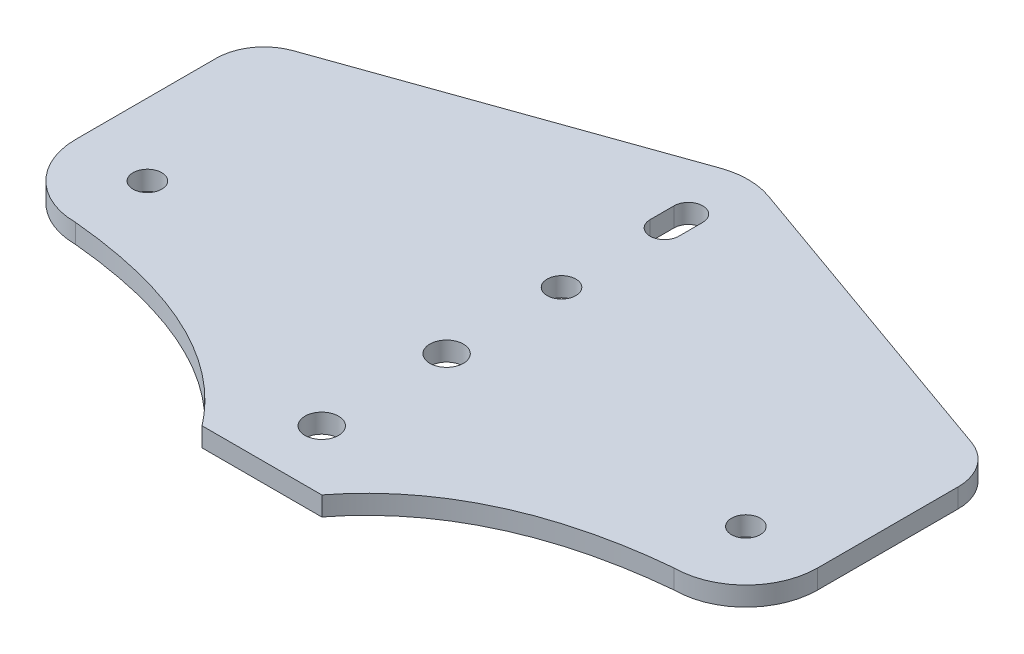
ISO-10303-21;
HEADER;
FILE_DESCRIPTION(('STEP AP214'),'2;1');
FILE_NAME('part.step','',(''),(''),'','','');
FILE_SCHEMA(('AUTOMOTIVE_DESIGN { 1 0 10303 214 1 1 1 1 }'));
ENDSEC;
DATA;
#1=APPLICATION_CONTEXT('core data for automotive mechanical design processes');
#2=APPLICATION_PROTOCOL_DEFINITION('international standard','automotive_design',2000,#1);
#3=PRODUCT_CONTEXT('',#1,'mechanical');
#4=PRODUCT('Part','Part','',(#3));
#5=PRODUCT_RELATED_PRODUCT_CATEGORY('part','',(#4));
#6=PRODUCT_DEFINITION_FORMATION('','',#4);
#7=PRODUCT_DEFINITION_CONTEXT('part definition',#1,'design');
#8=PRODUCT_DEFINITION('design','',#6,#7);
#9=PRODUCT_DEFINITION_SHAPE('','',#8);
#10=(LENGTH_UNIT() NAMED_UNIT(*) SI_UNIT(.MILLI.,.METRE.));
#11=(NAMED_UNIT(*) PLANE_ANGLE_UNIT() SI_UNIT($,.RADIAN.));
#12=(NAMED_UNIT(*) SI_UNIT($,.STERADIAN.) SOLID_ANGLE_UNIT());
#13=UNCERTAINTY_MEASURE_WITH_UNIT(LENGTH_MEASURE(1.E-05),#10,'distance_accuracy_value','');
#14=(GEOMETRIC_REPRESENTATION_CONTEXT(3) GLOBAL_UNCERTAINTY_ASSIGNED_CONTEXT((#13)) GLOBAL_UNIT_ASSIGNED_CONTEXT((#10,
#11,#12)) REPRESENTATION_CONTEXT('',''));
#15=CARTESIAN_POINT('',(0.,0.,0.));
#16=DIRECTION('',(0.,0.,1.));
#17=DIRECTION('',(1.,0.,0.));
#18=AXIS2_PLACEMENT_3D('',#15,#16,#17);
#19=CARTESIAN_POINT('',(-66.2159705452722,4.,46.2836736201994));
#20=DIRECTION('',(0.,1.,0.));
#21=DIRECTION('',(0.,0.,1.));
#22=AXIS2_PLACEMENT_3D('',#19,#20,#21);
#23=PLANE('',#22);
#24=CARTESIAN_POINT('',(-3.71597054527223,4.,46.2836736201994));
#25=DIRECTION('',(0.,1.,0.));
#26=DIRECTION('',(0.,0.,1.));
#27=AXIS2_PLACEMENT_3D('',#24,#25,#26);
#28=CIRCLE('',#27,3.5);
#29=CARTESIAN_POINT('',(-3.71597054527223,4.,49.7836736201994));
#30=VERTEX_POINT('',#29);
#31=EDGE_CURVE('E188',#30,#30,#28,.T.);
#32=ORIENTED_EDGE('',*,*,#31,.F.);
#33=EDGE_LOOP('',(#32));
#34=FACE_BOUND('',#33,.T.);
#35=CARTESIAN_POINT('',(-66.2159705452722,4.,46.2836736201994));
#36=DIRECTION('',(0.,1.,0.));
#37=DIRECTION('',(0.,0.,1.));
#38=AXIS2_PLACEMENT_3D('',#35,#36,#37);
#39=CIRCLE('',#38,3.00000000000001);
#40=CARTESIAN_POINT('',(-66.2159705452722,4.,49.2836736201994));
#41=VERTEX_POINT('',#40);
#42=EDGE_CURVE('E212',#41,#41,#39,.T.);
#43=ORIENTED_EDGE('',*,*,#42,.F.);
#44=EDGE_LOOP('',(#43));
#45=FACE_BOUND('',#44,.T.);
#46=CARTESIAN_POINT('',(-66.2159705452722,4.,46.2836736201994));
#47=DIRECTION('',(0.,1.,0.));
#48=DIRECTION('',(0.,0.,1.));
#49=AXIS2_PLACEMENT_3D('',#46,#47,#48);
#50=CIRCLE('',#49,15.);
#51=CARTESIAN_POINT('',(-81.2159705452722,4.,46.2836736201994));
#52=VERTEX_POINT('',#51);
#53=CARTESIAN_POINT('',(-66.2159705452722,4.,61.2836736201994));
#54=VERTEX_POINT('',#53);
#55=EDGE_CURVE('E228',#52,#54,#50,.T.);
#56=ORIENTED_EDGE('',*,*,#55,.T.);
#57=CARTESIAN_POINT('',(-66.2159705452722,4.,61.2836736201994));
#58=CARTESIAN_POINT('',(-31.9884086190138,4.,64.4698398960954));
#59=CARTESIAN_POINT('',(-16.2159705452722,4.,84.8626355878748));
#60=B_SPLINE_CURVE_WITH_KNOTS('',2,(#57,#58,#59),.UNSPECIFIED.,.F.,.F.,(3,3),(0.,
0.615675343805839),.UNSPECIFIED.);
#61=CARTESIAN_POINT('',(-16.2159705452722,4.,84.8626355878748));
#62=VERTEX_POINT('',#61);
#63=EDGE_CURVE('E232',#54,#62,#60,.T.);
#64=ORIENTED_EDGE('',*,*,#63,.T.);
#65=DIRECTION('',(1.,0.,0.));
#66=VECTOR('',#65,1.);
#67=CARTESIAN_POINT('',(-16.2159705452722,4.,84.8626355878748));
#68=LINE('',#67,#66);
#69=CARTESIAN_POINT('',(8.78402945472778,4.,84.8626355878748));
#70=VERTEX_POINT('',#69);
#71=EDGE_CURVE('E239',#62,#70,#68,.T.);
#72=ORIENTED_EDGE('',*,*,#71,.T.);
#73=CARTESIAN_POINT('',(8.78402945472778,4.,84.8626355878748));
#74=CARTESIAN_POINT('',(24.5564675284694,4.,64.4698398960954));
#75=CARTESIAN_POINT('',(58.7840294547278,4.,61.2836736201994));
#76=B_SPLINE_CURVE_WITH_KNOTS('',2,(#73,#74,#75),.UNSPECIFIED.,.F.,.F.,(3,3),(0.,
0.615675343805838),.UNSPECIFIED.);
#77=CARTESIAN_POINT('',(58.7840294547278,4.,61.2836736201994));
#78=VERTEX_POINT('',#77);
#79=EDGE_CURVE('E258',#70,#78,#76,.T.);
#80=ORIENTED_EDGE('',*,*,#79,.T.);
#81=CARTESIAN_POINT('',(58.7840294547278,4.,46.2836736201994));
#82=DIRECTION('',(0.,1.,0.));
#83=DIRECTION('',(0.,0.,1.));
#84=AXIS2_PLACEMENT_3D('',#81,#82,#83);
#85=CIRCLE('',#84,15.);
#86=CARTESIAN_POINT('',(73.7840294547278,4.,46.2836736201994));
#87=VERTEX_POINT('',#86);
#88=EDGE_CURVE('E264',#78,#87,#85,.T.);
#89=ORIENTED_EDGE('',*,*,#88,.T.);
#90=DIRECTION('',(0.,0.,-1.));
#91=VECTOR('',#90,1.);
#92=CARTESIAN_POINT('',(73.7840294547278,4.,46.2836736201994));
#93=LINE('',#92,#91);
#94=CARTESIAN_POINT('',(73.7840294547278,4.,16.9255729833547));
#95=VERTEX_POINT('',#94);
#96=EDGE_CURVE('E270',#87,#95,#93,.T.);
#97=ORIENTED_EDGE('',*,*,#96,.T.);
#98=CARTESIAN_POINT('',(63.7840294547278,4.,16.9255729833547));
#99=DIRECTION('',(0.,1.,0.));
#100=DIRECTION('',(0.,0.,1.));
#101=AXIS2_PLACEMENT_3D('',#98,#99,#100);
#102=CIRCLE('',#101,10.);
#103=CARTESIAN_POINT('',(67.1275853171226,4.,7.50110301443627));
#104=VERTEX_POINT('',#103);
#105=EDGE_CURVE('E273',#95,#104,#102,.T.);
#106=ORIENTED_EDGE('',*,*,#105,.T.);
#107=DIRECTION('',(-0.942446996891839,0.,-0.33435558623949));
#108=VECTOR('',#107,1.);
#109=CARTESIAN_POINT('',(67.1275853171226,4.,7.50110301443627));
#110=LINE('',#109,#108);
#111=CARTESIAN_POINT('',(1.29936324832012,4.,-15.8530313331782));
#112=VERTEX_POINT('',#111);
#113=EDGE_CURVE('E276',#104,#112,#110,.T.);
#114=ORIENTED_EDGE('',*,*,#113,.T.);
#115=CARTESIAN_POINT('',(-3.71597054527223,4.,-1.7163263798006));
#116=DIRECTION('',(0.,1.,0.));
#117=DIRECTION('',(0.,0.,1.));
#118=AXIS2_PLACEMENT_3D('',#115,#116,#117);
#119=CIRCLE('',#118,15.);
#120=CARTESIAN_POINT('',(-8.73130433886458,4.,-15.8530313331782));
#121=VERTEX_POINT('',#120);
#122=EDGE_CURVE('E279',#112,#121,#119,.T.);
#123=ORIENTED_EDGE('',*,*,#122,.T.);
#124=DIRECTION('',(-0.942446996891839,0.,0.33435558623949));
#125=VECTOR('',#124,1.);
#126=CARTESIAN_POINT('',(-74.5595264076671,4.,7.50110301443627));
#127=LINE('',#126,#125);
#128=CARTESIAN_POINT('',(-74.5595264076671,4.,7.50110301443627));
#129=VERTEX_POINT('',#128);
#130=EDGE_CURVE('E282',#121,#129,#127,.T.);
#131=ORIENTED_EDGE('',*,*,#130,.T.);
#132=CARTESIAN_POINT('',(-71.2159705452722,4.,16.9255729833547));
#133=DIRECTION('',(0.,1.,0.));
#134=DIRECTION('',(0.,0.,-1.));
#135=AXIS2_PLACEMENT_3D('',#132,#133,#134);
#136=CIRCLE('',#135,10.);
#137=CARTESIAN_POINT('',(-81.2159705452722,4.,16.9255729833547));
#138=VERTEX_POINT('',#137);
#139=EDGE_CURVE('E285',#129,#138,#136,.T.);
#140=ORIENTED_EDGE('',*,*,#139,.T.);
#141=DIRECTION('',(0.,0.,1.));
#142=VECTOR('',#141,1.);
#143=CARTESIAN_POINT('',(-81.2159705452722,4.,46.2836736201994));
#144=LINE('',#143,#142);
#145=EDGE_CURVE('E288',#138,#52,#144,.T.);
#146=ORIENTED_EDGE('',*,*,#145,.T.);
#147=EDGE_LOOP('',(#56,#64,#72,#80,#89,#97,#106,#114,#123,#131,#140,#146));
#148=FACE_BOUND('',#147,.T.);
#149=CARTESIAN_POINT('',(-3.71597054527223,4.,22.2836736201994));
#150=DIRECTION('',(0.,1.,0.));
#151=DIRECTION('',(0.,0.,1.));
#152=AXIS2_PLACEMENT_3D('',#149,#150,#151);
#153=CIRCLE('',#152,3.);
#154=CARTESIAN_POINT('',(-3.71597054527223,4.,25.2836736201994));
#155=VERTEX_POINT('',#154);
#156=EDGE_CURVE('E220',#155,#155,#153,.T.);
#157=ORIENTED_EDGE('',*,*,#156,.F.);
#158=EDGE_LOOP('',(#157));
#159=FACE_BOUND('',#158,.T.);
#160=CARTESIAN_POINT('',(58.7840294547278,4.,46.2836736201994));
#161=DIRECTION('',(0.,1.,0.));
#162=DIRECTION('',(0.,0.,1.));
#163=AXIS2_PLACEMENT_3D('',#160,#161,#162);
#164=CIRCLE('',#163,3.);
#165=CARTESIAN_POINT('',(58.7840294547278,4.,49.2836736201994));
#166=VERTEX_POINT('',#165);
#167=EDGE_CURVE('E204',#166,#166,#164,.T.);
#168=ORIENTED_EDGE('',*,*,#167,.F.);
#169=EDGE_LOOP('',(#168));
#170=FACE_BOUND('',#169,.T.);
#171=DIRECTION('',(0.,0.,1.));
#172=VECTOR('',#171,1.);
#173=CARTESIAN_POINT('',(-6.71597054527223,4.,-4.2163263798006));
#174=LINE('',#173,#172);
#175=CARTESIAN_POINT('',(-6.71597054527223,4.,-4.2163263798006));
#176=VERTEX_POINT('',#175);
#177=CARTESIAN_POINT('',(-6.71597054527223,4.,0.783673620199402));
#178=VERTEX_POINT('',#177);
#179=EDGE_CURVE('E162',#176,#178,#174,.T.);
#180=ORIENTED_EDGE('',*,*,#179,.F.);
#181=CARTESIAN_POINT('',(-3.71597054527223,4.,-4.2163263798006));
#182=DIRECTION('',(0.,1.,0.));
#183=DIRECTION('',(0.,0.,1.));
#184=AXIS2_PLACEMENT_3D('',#181,#182,#183);
#185=CIRCLE('',#184,3.);
#186=CARTESIAN_POINT('',(-0.715970545272232,4.,-4.2163263798006));
#187=VERTEX_POINT('',#186);
#188=EDGE_CURVE('E153',#187,#176,#185,.T.);
#189=ORIENTED_EDGE('',*,*,#188,.F.);
#190=DIRECTION('',(0.,0.,-1.));
#191=VECTOR('',#190,1.);
#192=CARTESIAN_POINT('',(-0.715970545272232,4.,-4.2163263798006));
#193=LINE('',#192,#191);
#194=CARTESIAN_POINT('',(-0.715970545272226,4.,0.783673620199404));
#195=VERTEX_POINT('',#194);
#196=EDGE_CURVE('E180',#195,#187,#193,.T.);
#197=ORIENTED_EDGE('',*,*,#196,.F.);
#198=CARTESIAN_POINT('',(-3.71597054527223,4.,0.783673620199403));
#199=DIRECTION('',(0.,1.,0.));
#200=DIRECTION('',(0.,0.,1.));
#201=AXIS2_PLACEMENT_3D('',#198,#199,#200);
#202=CIRCLE('',#201,3.);
#203=EDGE_CURVE('E176',#178,#195,#202,.T.);
#204=ORIENTED_EDGE('',*,*,#203,.F.);
#205=EDGE_LOOP('',(#180,#189,#197,#204));
#206=FACE_BOUND('',#205,.T.);
#207=CARTESIAN_POINT('',(-3.71597054527222,4.,72.3626355878748));
#208=DIRECTION('',(0.,1.,0.));
#209=DIRECTION('',(0.,0.,1.));
#210=AXIS2_PLACEMENT_3D('',#207,#208,#209);
#211=CIRCLE('',#210,3.5);
#212=CARTESIAN_POINT('',(-3.71597054527222,4.,75.8626355878748));
#213=VERTEX_POINT('',#212);
#214=EDGE_CURVE('E628',#213,#213,#211,.T.);
#215=ORIENTED_EDGE('',*,*,#214,.F.);
#216=EDGE_LOOP('',(#215));
#217=FACE_BOUND('',#216,.T.);
#218=ADVANCED_FACE('F39',(#34,#45,#148,#159,#170,#206,#217),#23,.T.);
#219=CARTESIAN_POINT('',(-66.2159705452722,0.,46.2836736201994));
#220=DIRECTION('',(0.,1.,0.));
#221=DIRECTION('',(0.,0.,1.));
#222=AXIS2_PLACEMENT_3D('',#219,#220,#221);
#223=PLANE('',#222);
#224=CARTESIAN_POINT('',(58.7840294547278,0.,46.2836736201994));
#225=DIRECTION('',(0.,1.,0.));
#226=DIRECTION('',(0.,0.,1.));
#227=AXIS2_PLACEMENT_3D('',#224,#225,#226);
#228=CIRCLE('',#227,3.);
#229=CARTESIAN_POINT('',(58.7840294547278,0.,49.2836736201994));
#230=VERTEX_POINT('',#229);
#231=EDGE_CURVE('E171',#230,#230,#228,.T.);
#232=ORIENTED_EDGE('',*,*,#231,.T.);
#233=EDGE_LOOP('',(#232));
#234=FACE_BOUND('',#233,.T.);
#235=CARTESIAN_POINT('',(-66.2159705452722,0.,46.2836736201994));
#236=DIRECTION('',(0.,1.,0.));
#237=DIRECTION('',(0.,0.,1.));
#238=AXIS2_PLACEMENT_3D('',#235,#236,#237);
#239=CIRCLE('',#238,3.00000000000001);
#240=CARTESIAN_POINT('',(-66.2159705452722,0.,49.2836736201994));
#241=VERTEX_POINT('',#240);
#242=EDGE_CURVE('E208',#241,#241,#239,.T.);
#243=ORIENTED_EDGE('',*,*,#242,.T.);
#244=EDGE_LOOP('',(#243));
#245=FACE_BOUND('',#244,.T.);
#246=CARTESIAN_POINT('',(-3.71597054527223,0.,22.2836736201994));
#247=DIRECTION('',(0.,1.,0.));
#248=DIRECTION('',(0.,0.,1.));
#249=AXIS2_PLACEMENT_3D('',#246,#247,#248);
#250=CIRCLE('',#249,3.);
#251=CARTESIAN_POINT('',(-3.71597054527223,0.,25.2836736201994));
#252=VERTEX_POINT('',#251);
#253=EDGE_CURVE('E216',#252,#252,#250,.T.);
#254=ORIENTED_EDGE('',*,*,#253,.T.);
#255=EDGE_LOOP('',(#254));
#256=FACE_BOUND('',#255,.T.);
#257=CARTESIAN_POINT('',(-66.2159705452722,0.,46.2836736201994));
#258=DIRECTION('',(0.,1.,0.));
#259=DIRECTION('',(0.,0.,1.));
#260=AXIS2_PLACEMENT_3D('',#257,#258,#259);
#261=CIRCLE('',#260,15.);
#262=CARTESIAN_POINT('',(-81.2159705452722,0.,46.2836736201994));
#263=VERTEX_POINT('',#262);
#264=CARTESIAN_POINT('',(-66.2159705452722,0.,61.2836736201994));
#265=VERTEX_POINT('',#264);
#266=EDGE_CURVE('E224',#263,#265,#261,.T.);
#267=ORIENTED_EDGE('',*,*,#266,.F.);
#268=DIRECTION('',(0.,0.,1.));
#269=VECTOR('',#268,1.);
#270=CARTESIAN_POINT('',(-81.2159705452722,0.,46.2836736201994));
#271=LINE('',#270,#269);
#272=CARTESIAN_POINT('',(-81.2159705452722,0.,16.9255729833547));
#273=VERTEX_POINT('',#272);
#274=EDGE_CURVE('E233',#273,#263,#271,.T.);
#275=ORIENTED_EDGE('',*,*,#274,.F.);
#276=CARTESIAN_POINT('',(-71.2159705452722,0.,16.9255729833547));
#277=DIRECTION('',(0.,1.,0.));
#278=DIRECTION('',(0.,0.,-1.));
#279=AXIS2_PLACEMENT_3D('',#276,#277,#278);
#280=CIRCLE('',#279,10.);
#281=CARTESIAN_POINT('',(-74.5595264076671,0.,7.50110301443627));
#282=VERTEX_POINT('',#281);
#283=EDGE_CURVE('E332',#282,#273,#280,.T.);
#284=ORIENTED_EDGE('',*,*,#283,.F.);
#285=DIRECTION('',(-0.942446996891839,0.,0.33435558623949));
#286=VECTOR('',#285,1.);
#287=CARTESIAN_POINT('',(-74.5595264076671,0.,7.50110301443627));
#288=LINE('',#287,#286);
#289=CARTESIAN_POINT('',(-8.73130433886458,0.,-15.8530313331782));
#290=VERTEX_POINT('',#289);
#291=EDGE_CURVE('E329',#290,#282,#288,.T.);
#292=ORIENTED_EDGE('',*,*,#291,.F.);
#293=CARTESIAN_POINT('',(-3.71597054527223,0.,-1.7163263798006));
#294=DIRECTION('',(0.,1.,0.));
#295=DIRECTION('',(0.,0.,1.));
#296=AXIS2_PLACEMENT_3D('',#293,#294,#295);
#297=CIRCLE('',#296,15.);
#298=CARTESIAN_POINT('',(1.29936324832012,0.,-15.8530313331782));
#299=VERTEX_POINT('',#298);
#300=EDGE_CURVE('E326',#299,#290,#297,.T.);
#301=ORIENTED_EDGE('',*,*,#300,.F.);
#302=DIRECTION('',(-0.942446996891839,0.,-0.33435558623949));
#303=VECTOR('',#302,1.);
#304=CARTESIAN_POINT('',(67.1275853171226,0.,7.50110301443627));
#305=LINE('',#304,#303);
#306=CARTESIAN_POINT('',(67.1275853171226,0.,7.50110301443627));
#307=VERTEX_POINT('',#306);
#308=EDGE_CURVE('E323',#307,#299,#305,.T.);
#309=ORIENTED_EDGE('',*,*,#308,.F.);
#310=CARTESIAN_POINT('',(63.7840294547278,0.,16.9255729833547));
#311=DIRECTION('',(0.,1.,0.));
#312=DIRECTION('',(0.,0.,1.));
#313=AXIS2_PLACEMENT_3D('',#310,#311,#312);
#314=CIRCLE('',#313,10.);
#315=CARTESIAN_POINT('',(73.7840294547278,0.,16.9255729833547));
#316=VERTEX_POINT('',#315);
#317=EDGE_CURVE('E320',#316,#307,#314,.T.);
#318=ORIENTED_EDGE('',*,*,#317,.F.);
#319=DIRECTION('',(0.,0.,-1.));
#320=VECTOR('',#319,1.);
#321=CARTESIAN_POINT('',(73.7840294547278,0.,46.2836736201994));
#322=LINE('',#321,#320);
#323=CARTESIAN_POINT('',(73.7840294547278,0.,46.2836736201994));
#324=VERTEX_POINT('',#323);
#325=EDGE_CURVE('E317',#324,#316,#322,.T.);
#326=ORIENTED_EDGE('',*,*,#325,.F.);
#327=CARTESIAN_POINT('',(58.7840294547278,0.,46.2836736201994));
#328=DIRECTION('',(0.,1.,0.));
#329=DIRECTION('',(0.,0.,1.));
#330=AXIS2_PLACEMENT_3D('',#327,#328,#329);
#331=CIRCLE('',#330,15.);
#332=CARTESIAN_POINT('',(58.7840294547278,0.,61.2836736201994));
#333=VERTEX_POINT('',#332);
#334=EDGE_CURVE('E311',#333,#324,#331,.T.);
#335=ORIENTED_EDGE('',*,*,#334,.F.);
#336=CARTESIAN_POINT('',(8.78402945472778,0.,84.8626355878748));
#337=CARTESIAN_POINT('',(24.5564675284694,0.,64.4698398960954));
#338=CARTESIAN_POINT('',(58.7840294547278,0.,61.2836736201994));
#339=B_SPLINE_CURVE_WITH_KNOTS('',2,(#336,#337,#338),.UNSPECIFIED.,.F.,.F.,(3,3),(0.,
0.615675343805838),.UNSPECIFIED.);
#340=CARTESIAN_POINT('',(8.78402945472778,0.,84.8626355878748));
#341=VERTEX_POINT('',#340);
#342=EDGE_CURVE('E306',#341,#333,#339,.T.);
#343=ORIENTED_EDGE('',*,*,#342,.F.);
#344=DIRECTION('',(1.,0.,0.));
#345=VECTOR('',#344,1.);
#346=CARTESIAN_POINT('',(-16.2159705452722,0.,84.8626355878748));
#347=LINE('',#346,#345);
#348=CARTESIAN_POINT('',(-16.2159705452722,0.,84.8626355878748));
#349=VERTEX_POINT('',#348);
#350=EDGE_CURVE('E300',#349,#341,#347,.T.);
#351=ORIENTED_EDGE('',*,*,#350,.F.);
#352=CARTESIAN_POINT('',(-66.2159705452722,0.,61.2836736201994));
#353=CARTESIAN_POINT('',(-31.9884086190138,0.,64.4698398960954));
#354=CARTESIAN_POINT('',(-16.2159705452722,0.,84.8626355878748));
#355=B_SPLINE_CURVE_WITH_KNOTS('',2,(#352,#353,#354),.UNSPECIFIED.,.F.,.F.,(3,3),(0.,
0.615675343805839),.UNSPECIFIED.);
#356=EDGE_CURVE('E295',#265,#349,#355,.T.);
#357=ORIENTED_EDGE('',*,*,#356,.F.);
#358=EDGE_LOOP('',(#267,#275,#284,#292,#301,#309,#318,#326,#335,#343,#351,#357));
#359=FACE_BOUND('',#358,.T.);
#360=CARTESIAN_POINT('',(-3.71597054527223,0.,-4.2163263798006));
#361=DIRECTION('',(0.,1.,0.));
#362=DIRECTION('',(0.,0.,1.));
#363=AXIS2_PLACEMENT_3D('',#360,#361,#362);
#364=CIRCLE('',#363,3.);
#365=CARTESIAN_POINT('',(-0.715970545272228,0.,-4.2163263798006));
#366=VERTEX_POINT('',#365);
#367=CARTESIAN_POINT('',(-6.71597054527223,0.,-4.2163263798006));
#368=VERTEX_POINT('',#367);
#369=EDGE_CURVE('E63',#366,#368,#364,.T.);
#370=ORIENTED_EDGE('',*,*,#369,.T.);
#371=DIRECTION('',(0.,0.,1.));
#372=VECTOR('',#371,1.);
#373=CARTESIAN_POINT('',(-6.71597054527223,0.,-4.2163263798006));
#374=LINE('',#373,#372);
#375=CARTESIAN_POINT('',(-6.71597054527223,0.,0.783673620199402));
#376=VERTEX_POINT('',#375);
#377=EDGE_CURVE('E169',#368,#376,#374,.T.);
#378=ORIENTED_EDGE('',*,*,#377,.T.);
#379=CARTESIAN_POINT('',(-3.71597054527223,0.,0.783673620199403));
#380=DIRECTION('',(0.,1.,0.));
#381=DIRECTION('',(0.,0.,1.));
#382=AXIS2_PLACEMENT_3D('',#379,#380,#381);
#383=CIRCLE('',#382,3.);
#384=CARTESIAN_POINT('',(-0.71597054527223,0.,0.783673620199403));
#385=VERTEX_POINT('',#384);
#386=EDGE_CURVE('E191',#376,#385,#383,.T.);
#387=ORIENTED_EDGE('',*,*,#386,.T.);
#388=DIRECTION('',(0.,0.,-1.));
#389=VECTOR('',#388,1.);
#390=CARTESIAN_POINT('',(-0.715970545272232,0.,-4.2163263798006));
#391=LINE('',#390,#389);
#392=EDGE_CURVE('E163',#385,#366,#391,.T.);
#393=ORIENTED_EDGE('',*,*,#392,.T.);
#394=EDGE_LOOP('',(#370,#378,#387,#393));
#395=FACE_BOUND('',#394,.T.);
#396=CARTESIAN_POINT('',(-3.71597054527223,0.,46.2836736201994));
#397=DIRECTION('',(0.,1.,0.));
#398=DIRECTION('',(0.,0.,1.));
#399=AXIS2_PLACEMENT_3D('',#396,#397,#398);
#400=CIRCLE('',#399,3.5);
#401=CARTESIAN_POINT('',(-3.71597054527223,0.,49.7836736201994));
#402=VERTEX_POINT('',#401);
#403=EDGE_CURVE('E636',#402,#402,#400,.T.);
#404=ORIENTED_EDGE('',*,*,#403,.T.);
#405=EDGE_LOOP('',(#404));
#406=FACE_BOUND('',#405,.T.);
#407=CARTESIAN_POINT('',(-3.71597054527222,0.,72.3626355878748));
#408=DIRECTION('',(0.,1.,0.));
#409=DIRECTION('',(0.,0.,1.));
#410=AXIS2_PLACEMENT_3D('',#407,#408,#409);
#411=CIRCLE('',#410,3.5);
#412=CARTESIAN_POINT('',(-3.71597054527222,0.,75.8626355878748));
#413=VERTEX_POINT('',#412);
#414=EDGE_CURVE('E631',#413,#413,#411,.T.);
#415=ORIENTED_EDGE('',*,*,#414,.T.);
#416=EDGE_LOOP('',(#415));
#417=FACE_BOUND('',#416,.T.);
#418=ADVANCED_FACE('F384',(#234,#245,#256,#359,#395,#406,#417),#223,.F.);
#419=CARTESIAN_POINT('',(-66.2159705452722,4.,46.2836736201994));
#420=DIRECTION('',(0.,-1.,0.));
#421=DIRECTION('',(0.,0.,-1.));
#422=AXIS2_PLACEMENT_3D('',#419,#420,#421);
#423=CYLINDRICAL_SURFACE('',#422,15.);
#424=ORIENTED_EDGE('',*,*,#266,.T.);
#425=DIRECTION('',(0.,-1.,0.));
#426=VECTOR('',#425,1.);
#427=CARTESIAN_POINT('',(-66.2159705452722,4.,61.2836736201994));
#428=LINE('',#427,#426);
#429=EDGE_CURVE('E11',#54,#265,#428,.T.);
#430=ORIENTED_EDGE('',*,*,#429,.F.);
#431=ORIENTED_EDGE('',*,*,#55,.F.);
#432=DIRECTION('',(0.,-1.,0.));
#433=VECTOR('',#432,1.);
#434=CARTESIAN_POINT('',(-81.2159705452722,4.,46.2836736201994));
#435=LINE('',#434,#433);
#436=EDGE_CURVE('E291',#52,#263,#435,.T.);
#437=ORIENTED_EDGE('',*,*,#436,.T.);
#438=EDGE_LOOP('',(#424,#430,#431,#437));
#439=FACE_BOUND('',#438,.T.);
#440=ADVANCED_FACE('F41',(#439),#423,.T.);
#441=DIRECTION('',(0.,-1.,0.));
#442=VECTOR('',#441,1.);
#443=SURFACE_OF_LINEAR_EXTRUSION('',#60,#442);
#444=ORIENTED_EDGE('',*,*,#356,.T.);
#445=DIRECTION('',(0.,-1.,0.));
#446=VECTOR('',#445,1.);
#447=CARTESIAN_POINT('',(-16.2159705452722,4.,84.8626355878748));
#448=LINE('',#447,#446);
#449=EDGE_CURVE('E48',#62,#349,#448,.T.);
#450=ORIENTED_EDGE('',*,*,#449,.F.);
#451=ORIENTED_EDGE('',*,*,#63,.F.);
#452=ORIENTED_EDGE('',*,*,#429,.T.);
#453=EDGE_LOOP('',(#444,#450,#451,#452));
#454=FACE_BOUND('',#453,.T.);
#455=ADVANCED_FACE('F244',(#454),#443,.F.);
#456=CARTESIAN_POINT('',(-16.2159705452722,4.,84.8626355878748));
#457=DIRECTION('',(0.,0.,-1.));
#458=DIRECTION('',(-1.,0.,0.));
#459=AXIS2_PLACEMENT_3D('',#456,#457,#458);
#460=PLANE('',#459);
#461=ORIENTED_EDGE('',*,*,#350,.T.);
#462=DIRECTION('',(0.,-1.,0.));
#463=VECTOR('',#462,1.);
#464=CARTESIAN_POINT('',(8.78402945472778,4.,84.8626355878748));
#465=LINE('',#464,#463);
#466=EDGE_CURVE('E372',#70,#341,#465,.T.);
#467=ORIENTED_EDGE('',*,*,#466,.F.);
#468=ORIENTED_EDGE('',*,*,#71,.F.);
#469=ORIENTED_EDGE('',*,*,#449,.T.);
#470=EDGE_LOOP('',(#461,#467,#468,#469));
#471=FACE_BOUND('',#470,.T.);
#472=ADVANCED_FACE('F247',(#471),#460,.F.);
#473=DIRECTION('',(0.,-1.,0.));
#474=VECTOR('',#473,1.);
#475=SURFACE_OF_LINEAR_EXTRUSION('',#76,#474);
#476=ORIENTED_EDGE('',*,*,#342,.T.);
#477=DIRECTION('',(0.,-1.,0.));
#478=VECTOR('',#477,1.);
#479=CARTESIAN_POINT('',(58.7840294547278,4.,61.2836736201994));
#480=LINE('',#479,#478);
#481=EDGE_CURVE('E368',#78,#333,#480,.T.);
#482=ORIENTED_EDGE('',*,*,#481,.F.);
#483=ORIENTED_EDGE('',*,*,#79,.F.);
#484=ORIENTED_EDGE('',*,*,#466,.T.);
#485=EDGE_LOOP('',(#476,#482,#483,#484));
#486=FACE_BOUND('',#485,.T.);
#487=ADVANCED_FACE('F251',(#486),#475,.F.);
#488=CARTESIAN_POINT('',(58.7840294547278,4.,46.2836736201994));
#489=DIRECTION('',(0.,-1.,0.));
#490=DIRECTION('',(0.,0.,-1.));
#491=AXIS2_PLACEMENT_3D('',#488,#489,#490);
#492=CYLINDRICAL_SURFACE('',#491,15.);
#493=ORIENTED_EDGE('',*,*,#334,.T.);
#494=DIRECTION('',(0.,-1.,0.));
#495=VECTOR('',#494,1.);
#496=CARTESIAN_POINT('',(73.7840294547278,4.,46.2836736201994));
#497=LINE('',#496,#495);
#498=EDGE_CURVE('E364',#87,#324,#497,.T.);
#499=ORIENTED_EDGE('',*,*,#498,.F.);
#500=ORIENTED_EDGE('',*,*,#88,.F.);
#501=ORIENTED_EDGE('',*,*,#481,.T.);
#502=EDGE_LOOP('',(#493,#499,#500,#501));
#503=FACE_BOUND('',#502,.T.);
#504=ADVANCED_FACE('F255',(#503),#492,.T.);
#505=CARTESIAN_POINT('',(73.7840294547278,4.,46.2836736201994));
#506=DIRECTION('',(-1.,0.,0.));
#507=DIRECTION('',(0.,0.,1.));
#508=AXIS2_PLACEMENT_3D('',#505,#506,#507);
#509=PLANE('',#508);
#510=ORIENTED_EDGE('',*,*,#325,.T.);
#511=DIRECTION('',(0.,-1.,0.));
#512=VECTOR('',#511,1.);
#513=CARTESIAN_POINT('',(73.7840294547278,4.,16.9255729833547));
#514=LINE('',#513,#512);
#515=EDGE_CURVE('E360',#95,#316,#514,.T.);
#516=ORIENTED_EDGE('',*,*,#515,.F.);
#517=ORIENTED_EDGE('',*,*,#96,.F.);
#518=ORIENTED_EDGE('',*,*,#498,.T.);
#519=EDGE_LOOP('',(#510,#516,#517,#518));
#520=FACE_BOUND('',#519,.T.);
#521=ADVANCED_FACE('F432',(#520),#509,.F.);
#522=CARTESIAN_POINT('',(63.7840294547278,4.,16.9255729833547));
#523=DIRECTION('',(0.,-1.,0.));
#524=DIRECTION('',(0.,0.,-1.));
#525=AXIS2_PLACEMENT_3D('',#522,#523,#524);
#526=CYLINDRICAL_SURFACE('',#525,10.);
#527=ORIENTED_EDGE('',*,*,#317,.T.);
#528=DIRECTION('',(0.,-1.,0.));
#529=VECTOR('',#528,1.);
#530=CARTESIAN_POINT('',(67.1275853171226,4.,7.50110301443627));
#531=LINE('',#530,#529);
#532=EDGE_CURVE('E356',#104,#307,#531,.T.);
#533=ORIENTED_EDGE('',*,*,#532,.F.);
#534=ORIENTED_EDGE('',*,*,#105,.F.);
#535=ORIENTED_EDGE('',*,*,#515,.T.);
#536=EDGE_LOOP('',(#527,#533,#534,#535));
#537=FACE_BOUND('',#536,.T.);
#538=ADVANCED_FACE('F430',(#537),#526,.T.);
#539=CARTESIAN_POINT('',(67.1275853171226,4.,7.50110301443627));
#540=DIRECTION('',(-0.33435558623949,0.,0.942446996891839));
#541=DIRECTION('',(0.942446996891839,0.,0.33435558623949));
#542=AXIS2_PLACEMENT_3D('',#539,#540,#541);
#543=PLANE('',#542);
#544=ORIENTED_EDGE('',*,*,#308,.T.);
#545=DIRECTION('',(0.,-1.,0.));
#546=VECTOR('',#545,1.);
#547=CARTESIAN_POINT('',(1.29936324832012,4.,-15.8530313331782));
#548=LINE('',#547,#546);
#549=EDGE_CURVE('E352',#112,#299,#548,.T.);
#550=ORIENTED_EDGE('',*,*,#549,.F.);
#551=ORIENTED_EDGE('',*,*,#113,.F.);
#552=ORIENTED_EDGE('',*,*,#532,.T.);
#553=EDGE_LOOP('',(#544,#550,#551,#552));
#554=FACE_BOUND('',#553,.T.);
#555=ADVANCED_FACE('F426',(#554),#543,.F.);
#556=CARTESIAN_POINT('',(-3.71597054527223,4.,-1.7163263798006));
#557=DIRECTION('',(0.,-1.,0.));
#558=DIRECTION('',(0.,0.,-1.));
#559=AXIS2_PLACEMENT_3D('',#556,#557,#558);
#560=CYLINDRICAL_SURFACE('',#559,15.);
#561=ORIENTED_EDGE('',*,*,#300,.T.);
#562=DIRECTION('',(0.,-1.,0.));
#563=VECTOR('',#562,1.);
#564=CARTESIAN_POINT('',(-8.73130433886458,4.,-15.8530313331782));
#565=LINE('',#564,#563);
#566=EDGE_CURVE('E348',#121,#290,#565,.T.);
#567=ORIENTED_EDGE('',*,*,#566,.F.);
#568=ORIENTED_EDGE('',*,*,#122,.F.);
#569=ORIENTED_EDGE('',*,*,#549,.T.);
#570=EDGE_LOOP('',(#561,#567,#568,#569));
#571=FACE_BOUND('',#570,.T.);
#572=ADVANCED_FACE('F421',(#571),#560,.T.);
#573=CARTESIAN_POINT('',(-74.5595264076671,4.,7.50110301443627));
#574=DIRECTION('',(0.33435558623949,0.,0.942446996891839));
#575=DIRECTION('',(0.942446996891839,0.,-0.33435558623949));
#576=AXIS2_PLACEMENT_3D('',#573,#574,#575);
#577=PLANE('',#576);
#578=ORIENTED_EDGE('',*,*,#291,.T.);
#579=DIRECTION('',(0.,-1.,0.));
#580=VECTOR('',#579,1.);
#581=CARTESIAN_POINT('',(-74.5595264076671,4.,7.50110301443627));
#582=LINE('',#581,#580);
#583=EDGE_CURVE('E344',#129,#282,#582,.T.);
#584=ORIENTED_EDGE('',*,*,#583,.F.);
#585=ORIENTED_EDGE('',*,*,#130,.F.);
#586=ORIENTED_EDGE('',*,*,#566,.T.);
#587=EDGE_LOOP('',(#578,#584,#585,#586));
#588=FACE_BOUND('',#587,.T.);
#589=ADVANCED_FACE('F415',(#588),#577,.F.);
#590=CARTESIAN_POINT('',(-71.2159705452722,4.,16.9255729833547));
#591=DIRECTION('',(0.,-1.,0.));
#592=DIRECTION('',(0.,0.,-1.));
#593=AXIS2_PLACEMENT_3D('',#590,#591,#592);
#594=CYLINDRICAL_SURFACE('',#593,10.);
#595=ORIENTED_EDGE('',*,*,#283,.T.);
#596=DIRECTION('',(0.,-1.,0.));
#597=VECTOR('',#596,1.);
#598=CARTESIAN_POINT('',(-81.2159705452722,4.,16.9255729833547));
#599=LINE('',#598,#597);
#600=EDGE_CURVE('E340',#138,#273,#599,.T.);
#601=ORIENTED_EDGE('',*,*,#600,.F.);
#602=ORIENTED_EDGE('',*,*,#139,.F.);
#603=ORIENTED_EDGE('',*,*,#583,.T.);
#604=EDGE_LOOP('',(#595,#601,#602,#603));
#605=FACE_BOUND('',#604,.T.);
#606=ADVANCED_FACE('F411',(#605),#594,.T.);
#607=CARTESIAN_POINT('',(-81.2159705452722,4.,46.2836736201994));
#608=DIRECTION('',(1.,0.,0.));
#609=DIRECTION('',(0.,0.,-1.));
#610=AXIS2_PLACEMENT_3D('',#607,#608,#609);
#611=PLANE('',#610);
#612=ORIENTED_EDGE('',*,*,#274,.T.);
#613=ORIENTED_EDGE('',*,*,#436,.F.);
#614=ORIENTED_EDGE('',*,*,#145,.F.);
#615=ORIENTED_EDGE('',*,*,#600,.T.);
#616=EDGE_LOOP('',(#612,#613,#614,#615));
#617=FACE_BOUND('',#616,.T.);
#618=ADVANCED_FACE('F406',(#617),#611,.F.);
#619=CARTESIAN_POINT('',(-3.71597054527223,4.,22.2836736201994));
#620=DIRECTION('',(0.,-1.,0.));
#621=DIRECTION('',(0.,0.,-1.));
#622=AXIS2_PLACEMENT_3D('',#619,#620,#621);
#623=CYLINDRICAL_SURFACE('',#622,3.);
#624=ORIENTED_EDGE('',*,*,#156,.T.);
#625=EDGE_LOOP('',(#624));
#626=FACE_BOUND('',#625,.T.);
#627=ORIENTED_EDGE('',*,*,#253,.F.);
#628=EDGE_LOOP('',(#627));
#629=FACE_BOUND('',#628,.T.);
#630=ADVANCED_FACE('F450',(#626,#629),#623,.F.);
#631=CARTESIAN_POINT('',(-66.2159705452722,4.,46.2836736201994));
#632=DIRECTION('',(0.,-1.,0.));
#633=DIRECTION('',(0.,0.,-1.));
#634=AXIS2_PLACEMENT_3D('',#631,#632,#633);
#635=CYLINDRICAL_SURFACE('',#634,3.00000000000001);
#636=ORIENTED_EDGE('',*,*,#42,.T.);
#637=EDGE_LOOP('',(#636));
#638=FACE_BOUND('',#637,.T.);
#639=ORIENTED_EDGE('',*,*,#242,.F.);
#640=EDGE_LOOP('',(#639));
#641=FACE_BOUND('',#640,.T.);
#642=ADVANCED_FACE('F488',(#638,#641),#635,.F.);
#643=CARTESIAN_POINT('',(58.7840294547278,4.,46.2836736201994));
#644=DIRECTION('',(0.,-1.,0.));
#645=DIRECTION('',(0.,0.,-1.));
#646=AXIS2_PLACEMENT_3D('',#643,#644,#645);
#647=CYLINDRICAL_SURFACE('',#646,3.);
#648=ORIENTED_EDGE('',*,*,#167,.T.);
#649=EDGE_LOOP('',(#648));
#650=FACE_BOUND('',#649,.T.);
#651=ORIENTED_EDGE('',*,*,#231,.F.);
#652=EDGE_LOOP('',(#651));
#653=FACE_BOUND('',#652,.T.);
#654=ADVANCED_FACE('F495',(#650,#653),#647,.F.);
#655=CARTESIAN_POINT('',(-3.71597054527223,4.,-4.2163263798006));
#656=DIRECTION('',(0.,-1.,0.));
#657=DIRECTION('',(0.,0.,-1.));
#658=AXIS2_PLACEMENT_3D('',#655,#656,#657);
#659=CYLINDRICAL_SURFACE('',#658,3.);
#660=ORIENTED_EDGE('',*,*,#369,.F.);
#661=DIRECTION('',(0.,-1.,0.));
#662=VECTOR('',#661,1.);
#663=CARTESIAN_POINT('',(-0.715970545272232,4.,-4.2163263798006));
#664=LINE('',#663,#662);
#665=EDGE_CURVE('E157',#187,#366,#664,.T.);
#666=ORIENTED_EDGE('',*,*,#665,.F.);
#667=ORIENTED_EDGE('',*,*,#188,.T.);
#668=DIRECTION('',(0.,-1.,0.));
#669=VECTOR('',#668,1.);
#670=CARTESIAN_POINT('',(-6.71597054527223,4.,-4.2163263798006));
#671=LINE('',#670,#669);
#672=EDGE_CURVE('E156',#176,#368,#671,.T.);
#673=ORIENTED_EDGE('',*,*,#672,.T.);
#674=EDGE_LOOP('',(#660,#666,#667,#673));
#675=FACE_BOUND('',#674,.T.);
#676=ADVANCED_FACE('F155',(#675),#659,.F.);
#677=CARTESIAN_POINT('',(-6.71597054527223,4.,-4.2163263798006));
#678=DIRECTION('',(1.,0.,0.));
#679=DIRECTION('',(0.,0.,-1.));
#680=AXIS2_PLACEMENT_3D('',#677,#678,#679);
#681=PLANE('',#680);
#682=ORIENTED_EDGE('',*,*,#377,.F.);
#683=ORIENTED_EDGE('',*,*,#672,.F.);
#684=ORIENTED_EDGE('',*,*,#179,.T.);
#685=DIRECTION('',(0.,-1.,0.));
#686=VECTOR('',#685,1.);
#687=CARTESIAN_POINT('',(-6.71597054527223,4.,0.783673620199402));
#688=LINE('',#687,#686);
#689=EDGE_CURVE('E172',#178,#376,#688,.T.);
#690=ORIENTED_EDGE('',*,*,#689,.T.);
#691=EDGE_LOOP('',(#682,#683,#684,#690));
#692=FACE_BOUND('',#691,.T.);
#693=ADVANCED_FACE('F166',(#692),#681,.T.);
#694=CARTESIAN_POINT('',(-3.71597054527223,4.,0.783673620199403));
#695=DIRECTION('',(0.,-1.,0.));
#696=DIRECTION('',(0.,0.,-1.));
#697=AXIS2_PLACEMENT_3D('',#694,#695,#696);
#698=CYLINDRICAL_SURFACE('',#697,3.);
#699=ORIENTED_EDGE('',*,*,#386,.F.);
#700=ORIENTED_EDGE('',*,*,#689,.F.);
#701=ORIENTED_EDGE('',*,*,#203,.T.);
#702=DIRECTION('',(0.,-1.,0.));
#703=VECTOR('',#702,1.);
#704=CARTESIAN_POINT('',(-0.71597054527223,4.,0.783673620199403));
#705=LINE('',#704,#703);
#706=EDGE_CURVE('E55',#195,#385,#705,.T.);
#707=ORIENTED_EDGE('',*,*,#706,.T.);
#708=EDGE_LOOP('',(#699,#700,#701,#707));
#709=FACE_BOUND('',#708,.T.);
#710=ADVANCED_FACE('F515',(#709),#698,.F.);
#711=CARTESIAN_POINT('',(-0.715970545272232,4.,-4.2163263798006));
#712=DIRECTION('',(-1.,0.,0.));
#713=DIRECTION('',(0.,0.,1.));
#714=AXIS2_PLACEMENT_3D('',#711,#712,#713);
#715=PLANE('',#714);
#716=ORIENTED_EDGE('',*,*,#392,.F.);
#717=ORIENTED_EDGE('',*,*,#706,.F.);
#718=ORIENTED_EDGE('',*,*,#196,.T.);
#719=ORIENTED_EDGE('',*,*,#665,.T.);
#720=EDGE_LOOP('',(#716,#717,#718,#719));
#721=FACE_BOUND('',#720,.T.);
#722=ADVANCED_FACE('F522',(#721),#715,.T.);
#723=CARTESIAN_POINT('',(-3.71597054527223,4.,46.2836736201994));
#724=DIRECTION('',(0.,-1.,0.));
#725=DIRECTION('',(0.,0.,-1.));
#726=AXIS2_PLACEMENT_3D('',#723,#724,#725);
#727=CYLINDRICAL_SURFACE('',#726,3.5);
#728=ORIENTED_EDGE('',*,*,#31,.T.);
#729=EDGE_LOOP('',(#728));
#730=FACE_BOUND('',#729,.T.);
#731=ORIENTED_EDGE('',*,*,#403,.F.);
#732=EDGE_LOOP('',(#731));
#733=FACE_BOUND('',#732,.T.);
#734=ADVANCED_FACE('F530',(#730,#733),#727,.F.);
#735=CARTESIAN_POINT('',(-3.71597054527222,4.,72.3626355878748));
#736=DIRECTION('',(0.,-1.,0.));
#737=DIRECTION('',(0.,0.,-1.));
#738=AXIS2_PLACEMENT_3D('',#735,#736,#737);
#739=CYLINDRICAL_SURFACE('',#738,3.5);
#740=ORIENTED_EDGE('',*,*,#214,.T.);
#741=EDGE_LOOP('',(#740));
#742=FACE_BOUND('',#741,.T.);
#743=ORIENTED_EDGE('',*,*,#414,.F.);
#744=EDGE_LOOP('',(#743));
#745=FACE_BOUND('',#744,.T.);
#746=ADVANCED_FACE('F537',(#742,#745),#739,.F.);
#747=CLOSED_SHELL('',(#218,#418,#440,#455,#472,#487,#504,#521,#538,#555,#572,#589,#606,#618,
#630,#642,#654,#676,#693,#710,#722,#734,#746));
#748=MANIFOLD_SOLID_BREP('B2',#747);
#749=ADVANCED_BREP_SHAPE_REPRESENTATION('',(#18,#748),#14);
#750=SHAPE_DEFINITION_REPRESENTATION(#9,#749);
ENDSEC;
END-ISO-10303-21;
